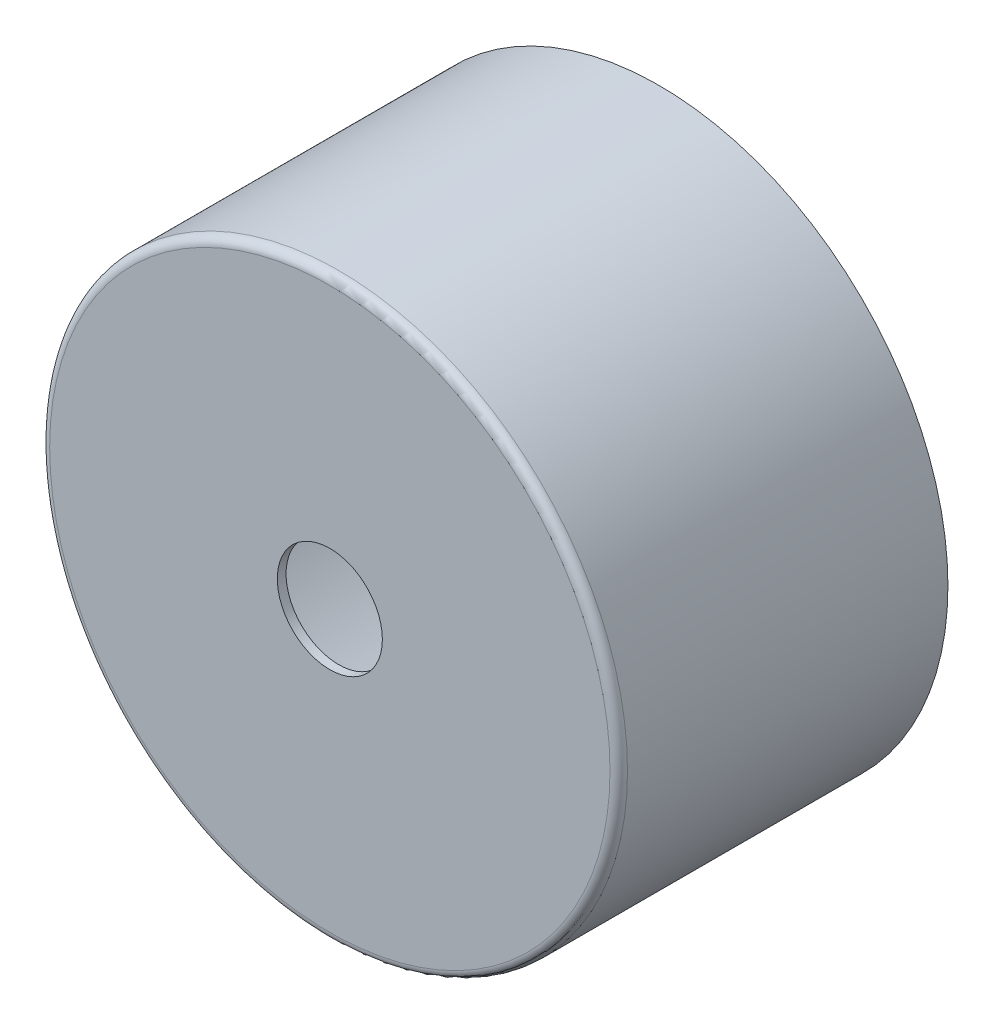
ISO-10303-21;
HEADER;
FILE_DESCRIPTION(('STEP AP214'),'2;1');
FILE_NAME('part.step','',(''),(''),'','','');
FILE_SCHEMA(('AUTOMOTIVE_DESIGN { 1 0 10303 214 1 1 1 1 }'));
ENDSEC;
DATA;
#1=APPLICATION_CONTEXT('core data for automotive mechanical design processes');
#2=APPLICATION_PROTOCOL_DEFINITION('international standard','automotive_design',2000,#1);
#3=PRODUCT_CONTEXT('',#1,'mechanical');
#4=PRODUCT('Part','Part','',(#3));
#5=PRODUCT_RELATED_PRODUCT_CATEGORY('part','',(#4));
#6=PRODUCT_DEFINITION_FORMATION('','',#4);
#7=PRODUCT_DEFINITION_CONTEXT('part definition',#1,'design');
#8=PRODUCT_DEFINITION('design','',#6,#7);
#9=PRODUCT_DEFINITION_SHAPE('','',#8);
#10=(LENGTH_UNIT() NAMED_UNIT(*) SI_UNIT(.MILLI.,.METRE.));
#11=(NAMED_UNIT(*) PLANE_ANGLE_UNIT() SI_UNIT($,.RADIAN.));
#12=(NAMED_UNIT(*) SI_UNIT($,.STERADIAN.) SOLID_ANGLE_UNIT());
#13=UNCERTAINTY_MEASURE_WITH_UNIT(LENGTH_MEASURE(1.E-05),#10,'distance_accuracy_value','');
#14=(GEOMETRIC_REPRESENTATION_CONTEXT(3) GLOBAL_UNCERTAINTY_ASSIGNED_CONTEXT((#13)) GLOBAL_UNIT_ASSIGNED_CONTEXT((#10,
#11,#12)) REPRESENTATION_CONTEXT('',''));
#15=CARTESIAN_POINT('',(0.,0.,0.));
#16=DIRECTION('',(0.,0.,1.));
#17=DIRECTION('',(1.,0.,0.));
#18=AXIS2_PLACEMENT_3D('',#15,#16,#17);
#19=CARTESIAN_POINT('',(0.,0.,-18.8));
#20=DIRECTION('',(0.,0.,1.));
#21=DIRECTION('',(1.,0.,0.));
#22=AXIS2_PLACEMENT_3D('',#19,#20,#21);
#23=CYLINDRICAL_SURFACE('',#22,16.5);
#24=CARTESIAN_POINT('',(0.,0.,-0.5));
#25=DIRECTION('',(0.,0.,1.));
#26=DIRECTION('',(1.,0.,0.));
#27=AXIS2_PLACEMENT_3D('',#24,#25,#26);
#28=CIRCLE('',#27,16.5);
#29=CARTESIAN_POINT('',(16.5,0.,-0.5));
#30=VERTEX_POINT('',#29);
#31=EDGE_CURVE('E12',#30,#30,#28,.F.);
#32=ORIENTED_EDGE('',*,*,#31,.T.);
#33=EDGE_LOOP('',(#32));
#34=FACE_BOUND('',#33,.T.);
#35=CARTESIAN_POINT('',(0.,0.,-18.8));
#36=DIRECTION('',(0.,0.,1.));
#37=DIRECTION('',(1.,0.,0.));
#38=AXIS2_PLACEMENT_3D('',#35,#36,#37);
#39=CIRCLE('',#38,16.5);
#40=CARTESIAN_POINT('',(16.5,0.,-18.8));
#41=VERTEX_POINT('',#40);
#42=EDGE_CURVE('E58',#41,#41,#39,.T.);
#43=ORIENTED_EDGE('',*,*,#42,.T.);
#44=EDGE_LOOP('',(#43));
#45=FACE_BOUND('',#44,.T.);
#46=ADVANCED_FACE('F47',(#34,#45),#23,.T.);
#47=CARTESIAN_POINT('',(0.,0.,-18.8));
#48=DIRECTION('',(0.,0.,1.));
#49=DIRECTION('',(1.,0.,0.));
#50=AXIS2_PLACEMENT_3D('',#47,#48,#49);
#51=PLANE('',#50);
#52=CARTESIAN_POINT('',(0.,0.,-18.8));
#53=DIRECTION('',(0.,0.,1.));
#54=DIRECTION('',(1.,0.,0.));
#55=AXIS2_PLACEMENT_3D('',#52,#53,#54);
#56=CIRCLE('',#55,16.);
#57=CARTESIAN_POINT('',(16.,0.,-18.8));
#58=VERTEX_POINT('',#57);
#59=EDGE_CURVE('E62',#58,#58,#56,.T.);
#60=ORIENTED_EDGE('',*,*,#59,.T.);
#61=EDGE_LOOP('',(#60));
#62=FACE_BOUND('',#61,.T.);
#63=ORIENTED_EDGE('',*,*,#42,.F.);
#64=EDGE_LOOP('',(#63));
#65=FACE_BOUND('',#64,.T.);
#66=ADVANCED_FACE('F83',(#62,#65),#51,.F.);
#67=CARTESIAN_POINT('',(0.,0.,0.));
#68=DIRECTION('',(0.,0.,1.));
#69=DIRECTION('',(1.,0.,0.));
#70=AXIS2_PLACEMENT_3D('',#67,#68,#69);
#71=PLANE('',#70);
#72=CARTESIAN_POINT('',(0.,0.,0.));
#73=DIRECTION('',(0.,0.,1.));
#74=DIRECTION('',(1.,0.,0.));
#75=AXIS2_PLACEMENT_3D('',#72,#73,#74);
#76=CIRCLE('',#75,16.);
#77=CARTESIAN_POINT('',(16.,0.,0.));
#78=VERTEX_POINT('',#77);
#79=EDGE_CURVE('E54',#78,#78,#76,.T.);
#80=ORIENTED_EDGE('',*,*,#79,.T.);
#81=EDGE_LOOP('',(#80));
#82=FACE_BOUND('',#81,.T.);
#83=CARTESIAN_POINT('',(0.,0.,0.));
#84=DIRECTION('',(0.,0.,1.));
#85=DIRECTION('',(1.,0.,0.));
#86=AXIS2_PLACEMENT_3D('',#83,#84,#85);
#87=CIRCLE('',#86,3.);
#88=CARTESIAN_POINT('',(3.,0.,0.));
#89=VERTEX_POINT('',#88);
#90=EDGE_CURVE('E68',#89,#89,#87,.T.);
#91=ORIENTED_EDGE('',*,*,#90,.F.);
#92=EDGE_LOOP('',(#91));
#93=FACE_BOUND('',#92,.T.);
#94=ADVANCED_FACE('F80',(#82,#93),#71,.T.);
#95=CARTESIAN_POINT('',(0.,0.,-18.8));
#96=DIRECTION('',(0.,0.,1.));
#97=DIRECTION('',(1.,0.,0.));
#98=AXIS2_PLACEMENT_3D('',#95,#96,#97);
#99=CYLINDRICAL_SURFACE('',#98,16.);
#100=ORIENTED_EDGE('',*,*,#59,.F.);
#101=EDGE_LOOP('',(#100));
#102=FACE_BOUND('',#101,.T.);
#103=CARTESIAN_POINT('',(0.,0.,-0.5));
#104=DIRECTION('',(0.,0.,1.));
#105=DIRECTION('',(1.,0.,0.));
#106=AXIS2_PLACEMENT_3D('',#103,#104,#105);
#107=CIRCLE('',#106,16.);
#108=CARTESIAN_POINT('',(16.,0.,-0.5));
#109=VERTEX_POINT('',#108);
#110=EDGE_CURVE('E67',#109,#109,#107,.T.);
#111=ORIENTED_EDGE('',*,*,#110,.T.);
#112=EDGE_LOOP('',(#111));
#113=FACE_BOUND('',#112,.T.);
#114=ADVANCED_FACE('F82',(#102,#113),#99,.F.);
#115=CARTESIAN_POINT('',(0.,0.,-0.5));
#116=DIRECTION('',(0.,0.,1.));
#117=DIRECTION('',(1.,0.,0.));
#118=AXIS2_PLACEMENT_3D('',#115,#116,#117);
#119=PLANE('',#118);
#120=CARTESIAN_POINT('',(0.,0.,-0.5));
#121=DIRECTION('',(0.,0.,1.));
#122=DIRECTION('',(1.,0.,0.));
#123=AXIS2_PLACEMENT_3D('',#120,#121,#122);
#124=CIRCLE('',#123,3.);
#125=CARTESIAN_POINT('',(3.,0.,-0.5));
#126=VERTEX_POINT('',#125);
#127=EDGE_CURVE('E65',#126,#126,#124,.T.);
#128=ORIENTED_EDGE('',*,*,#127,.T.);
#129=EDGE_LOOP('',(#128));
#130=FACE_BOUND('',#129,.T.);
#131=ORIENTED_EDGE('',*,*,#110,.F.);
#132=EDGE_LOOP('',(#131));
#133=FACE_BOUND('',#132,.T.);
#134=ADVANCED_FACE('F89',(#130,#133),#119,.F.);
#135=CARTESIAN_POINT('',(0.,0.,-18.8));
#136=DIRECTION('',(0.,0.,1.));
#137=DIRECTION('',(1.,0.,0.));
#138=AXIS2_PLACEMENT_3D('',#135,#136,#137);
#139=CYLINDRICAL_SURFACE('',#138,3.);
#140=ORIENTED_EDGE('',*,*,#90,.T.);
#141=EDGE_LOOP('',(#140));
#142=FACE_BOUND('',#141,.T.);
#143=ORIENTED_EDGE('',*,*,#127,.F.);
#144=EDGE_LOOP('',(#143));
#145=FACE_BOUND('',#144,.T.);
#146=ADVANCED_FACE('F77',(#142,#145),#139,.F.);
#147=CARTESIAN_POINT('',(0.,0.,-0.5));
#148=DIRECTION('',(0.,0.,1.));
#149=DIRECTION('',(1.,0.,0.));
#150=AXIS2_PLACEMENT_3D('',#147,#148,#149);
#151=TOROIDAL_SURFACE('',#150,16.,0.5);
#152=ORIENTED_EDGE('',*,*,#31,.F.);
#153=EDGE_LOOP('',(#152));
#154=FACE_BOUND('',#153,.T.);
#155=ORIENTED_EDGE('',*,*,#79,.F.);
#156=EDGE_LOOP('',(#155));
#157=FACE_BOUND('',#156,.T.);
#158=ADVANCED_FACE('F49',(#154,#157),#151,.T.);
#159=CLOSED_SHELL('',(#46,#66,#94,#114,#134,#146,#158));
#160=MANIFOLD_SOLID_BREP('B2',#159);
#161=ADVANCED_BREP_SHAPE_REPRESENTATION('',(#18,#160),#14);
#162=SHAPE_DEFINITION_REPRESENTATION(#9,#161);
ENDSEC;
END-ISO-10303-21;
